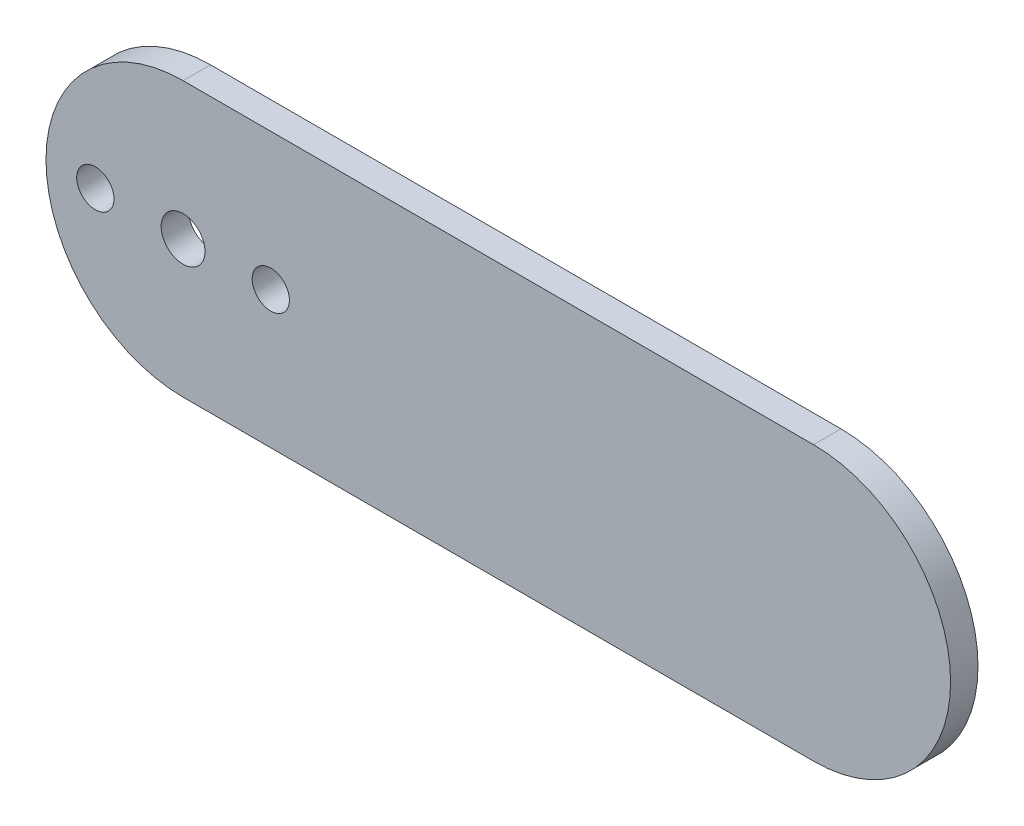
ISO-10303-21;
HEADER;
FILE_DESCRIPTION(('STEP AP214'),'2;1');
FILE_NAME('part.step','',(''),(''),'','','');
FILE_SCHEMA(('AUTOMOTIVE_DESIGN { 1 0 10303 214 1 1 1 1 }'));
ENDSEC;
DATA;
#1=APPLICATION_CONTEXT('core data for automotive mechanical design processes');
#2=APPLICATION_PROTOCOL_DEFINITION('international standard','automotive_design',2000,#1);
#3=PRODUCT_CONTEXT('',#1,'mechanical');
#4=PRODUCT('Part','Part','',(#3));
#5=PRODUCT_RELATED_PRODUCT_CATEGORY('part','',(#4));
#6=PRODUCT_DEFINITION_FORMATION('','',#4);
#7=PRODUCT_DEFINITION_CONTEXT('part definition',#1,'design');
#8=PRODUCT_DEFINITION('design','',#6,#7);
#9=PRODUCT_DEFINITION_SHAPE('','',#8);
#10=(LENGTH_UNIT() NAMED_UNIT(*) SI_UNIT(.MILLI.,.METRE.));
#11=(NAMED_UNIT(*) PLANE_ANGLE_UNIT() SI_UNIT($,.RADIAN.));
#12=(NAMED_UNIT(*) SI_UNIT($,.STERADIAN.) SOLID_ANGLE_UNIT());
#13=UNCERTAINTY_MEASURE_WITH_UNIT(LENGTH_MEASURE(1.E-05),#10,'distance_accuracy_value','');
#14=(GEOMETRIC_REPRESENTATION_CONTEXT(3) GLOBAL_UNCERTAINTY_ASSIGNED_CONTEXT((#13)) GLOBAL_UNIT_ASSIGNED_CONTEXT((#10,
#11,#12)) REPRESENTATION_CONTEXT('',''));
#15=CARTESIAN_POINT('',(0.,0.,0.));
#16=DIRECTION('',(0.,0.,1.));
#17=DIRECTION('',(1.,0.,0.));
#18=AXIS2_PLACEMENT_3D('',#15,#16,#17);
#19=CARTESIAN_POINT('',(0.,0.,2.5));
#20=DIRECTION('',(0.,0.,1.));
#21=DIRECTION('',(1.,0.,0.));
#22=AXIS2_PLACEMENT_3D('',#19,#20,#21);
#23=PLANE('',#22);
#24=CARTESIAN_POINT('',(16.,0.,2.5));
#25=DIRECTION('',(0.,0.,1.));
#26=DIRECTION('',(1.,0.,0.));
#27=AXIS2_PLACEMENT_3D('',#24,#25,#26);
#28=CIRCLE('',#27,3.4);
#29=CARTESIAN_POINT('',(19.4,0.,2.5));
#30=VERTEX_POINT('',#29);
#31=EDGE_CURVE('E114',#30,#30,#28,.T.);
#32=ORIENTED_EDGE('',*,*,#31,.F.);
#33=EDGE_LOOP('',(#32));
#34=FACE_BOUND('',#33,.T.);
#35=CARTESIAN_POINT('',(0.,0.,2.5));
#36=DIRECTION('',(0.,0.,1.));
#37=DIRECTION('',(1.,0.,0.));
#38=AXIS2_PLACEMENT_3D('',#35,#36,#37);
#39=CIRCLE('',#38,25.);
#40=CARTESIAN_POINT('',(0.,25.,2.5));
#41=VERTEX_POINT('',#40);
#42=CARTESIAN_POINT('',(0.,-25.,2.5));
#43=VERTEX_POINT('',#42);
#44=EDGE_CURVE('E84',#41,#43,#39,.T.);
#45=ORIENTED_EDGE('',*,*,#44,.T.);
#46=DIRECTION('',(1.,0.,0.));
#47=VECTOR('',#46,1.);
#48=CARTESIAN_POINT('',(0.,-25.,2.5));
#49=LINE('',#48,#47);
#50=CARTESIAN_POINT('',(115.,-25.,2.5));
#51=VERTEX_POINT('',#50);
#52=EDGE_CURVE('E79',#43,#51,#49,.T.);
#53=ORIENTED_EDGE('',*,*,#52,.T.);
#54=CARTESIAN_POINT('',(115.,0.,2.5));
#55=DIRECTION('',(0.,0.,1.));
#56=DIRECTION('',(1.,0.,0.));
#57=AXIS2_PLACEMENT_3D('',#54,#55,#56);
#58=CIRCLE('',#57,25.);
#59=CARTESIAN_POINT('',(115.,25.,2.5));
#60=VERTEX_POINT('',#59);
#61=EDGE_CURVE('E82',#51,#60,#58,.T.);
#62=ORIENTED_EDGE('',*,*,#61,.T.);
#63=DIRECTION('',(-1.,0.,0.));
#64=VECTOR('',#63,1.);
#65=CARTESIAN_POINT('',(0.,25.,2.5));
#66=LINE('',#65,#64);
#67=EDGE_CURVE('E49',#60,#41,#66,.T.);
#68=ORIENTED_EDGE('',*,*,#67,.T.);
#69=EDGE_LOOP('',(#45,#53,#62,#68));
#70=FACE_BOUND('',#69,.T.);
#71=CARTESIAN_POINT('',(0.,0.,2.5));
#72=DIRECTION('',(0.,0.,1.));
#73=DIRECTION('',(1.,0.,0.));
#74=AXIS2_PLACEMENT_3D('',#71,#72,#73);
#75=CIRCLE('',#74,4.);
#76=CARTESIAN_POINT('',(4.,0.,2.5));
#77=VERTEX_POINT('',#76);
#78=EDGE_CURVE('E99',#77,#77,#75,.T.);
#79=ORIENTED_EDGE('',*,*,#78,.F.);
#80=EDGE_LOOP('',(#79));
#81=FACE_BOUND('',#80,.T.);
#82=CARTESIAN_POINT('',(-16.,0.,2.5));
#83=DIRECTION('',(0.,0.,1.));
#84=DIRECTION('',(1.,0.,0.));
#85=AXIS2_PLACEMENT_3D('',#82,#83,#84);
#86=CIRCLE('',#85,3.4);
#87=CARTESIAN_POINT('',(-12.6,0.,2.5));
#88=VERTEX_POINT('',#87);
#89=EDGE_CURVE('E120',#88,#88,#86,.T.);
#90=ORIENTED_EDGE('',*,*,#89,.F.);
#91=EDGE_LOOP('',(#90));
#92=FACE_BOUND('',#91,.T.);
#93=ADVANCED_FACE('F32',(#34,#70,#81,#92),#23,.T.);
#94=CARTESIAN_POINT('',(0.,0.,-2.5));
#95=DIRECTION('',(0.,0.,1.));
#96=DIRECTION('',(1.,0.,0.));
#97=AXIS2_PLACEMENT_3D('',#94,#95,#96);
#98=PLANE('',#97);
#99=CARTESIAN_POINT('',(0.,0.,-2.5));
#100=DIRECTION('',(0.,0.,1.));
#101=DIRECTION('',(1.,0.,0.));
#102=AXIS2_PLACEMENT_3D('',#99,#100,#101);
#103=CIRCLE('',#102,25.);
#104=CARTESIAN_POINT('',(0.,25.,-2.5));
#105=VERTEX_POINT('',#104);
#106=CARTESIAN_POINT('',(0.,-25.,-2.5));
#107=VERTEX_POINT('',#106);
#108=EDGE_CURVE('E96',#105,#107,#103,.T.);
#109=ORIENTED_EDGE('',*,*,#108,.F.);
#110=DIRECTION('',(-1.,0.,0.));
#111=VECTOR('',#110,1.);
#112=CARTESIAN_POINT('',(0.,25.,-2.5));
#113=LINE('',#112,#111);
#114=CARTESIAN_POINT('',(115.,25.,-2.5));
#115=VERTEX_POINT('',#114);
#116=EDGE_CURVE('E72',#115,#105,#113,.T.);
#117=ORIENTED_EDGE('',*,*,#116,.F.);
#118=CARTESIAN_POINT('',(115.,0.,-2.5));
#119=DIRECTION('',(0.,0.,1.));
#120=DIRECTION('',(1.,0.,0.));
#121=AXIS2_PLACEMENT_3D('',#118,#119,#120);
#122=CIRCLE('',#121,25.);
#123=CARTESIAN_POINT('',(115.,-25.,-2.5));
#124=VERTEX_POINT('',#123);
#125=EDGE_CURVE('E66',#124,#115,#122,.T.);
#126=ORIENTED_EDGE('',*,*,#125,.F.);
#127=DIRECTION('',(1.,0.,0.));
#128=VECTOR('',#127,1.);
#129=CARTESIAN_POINT('',(0.,-25.,-2.5));
#130=LINE('',#129,#128);
#131=EDGE_CURVE('E88',#107,#124,#130,.T.);
#132=ORIENTED_EDGE('',*,*,#131,.F.);
#133=EDGE_LOOP('',(#109,#117,#126,#132));
#134=FACE_BOUND('',#133,.T.);
#135=CARTESIAN_POINT('',(0.,0.,-2.5));
#136=DIRECTION('',(0.,0.,1.));
#137=DIRECTION('',(1.,0.,0.));
#138=AXIS2_PLACEMENT_3D('',#135,#136,#137);
#139=CIRCLE('',#138,4.);
#140=CARTESIAN_POINT('',(4.,0.,-2.5));
#141=VERTEX_POINT('',#140);
#142=EDGE_CURVE('E111',#141,#141,#139,.T.);
#143=ORIENTED_EDGE('',*,*,#142,.T.);
#144=EDGE_LOOP('',(#143));
#145=FACE_BOUND('',#144,.T.);
#146=CARTESIAN_POINT('',(16.,0.,-2.5));
#147=DIRECTION('',(0.,0.,1.));
#148=DIRECTION('',(1.,0.,0.));
#149=AXIS2_PLACEMENT_3D('',#146,#147,#148);
#150=CIRCLE('',#149,3.4);
#151=CARTESIAN_POINT('',(19.4,0.,-2.5));
#152=VERTEX_POINT('',#151);
#153=EDGE_CURVE('E117',#152,#152,#150,.T.);
#154=ORIENTED_EDGE('',*,*,#153,.T.);
#155=EDGE_LOOP('',(#154));
#156=FACE_BOUND('',#155,.T.);
#157=CARTESIAN_POINT('',(-16.,0.,-2.5));
#158=DIRECTION('',(0.,0.,1.));
#159=DIRECTION('',(1.,0.,0.));
#160=AXIS2_PLACEMENT_3D('',#157,#158,#159);
#161=CIRCLE('',#160,3.4);
#162=CARTESIAN_POINT('',(-12.6,0.,-2.5));
#163=VERTEX_POINT('',#162);
#164=EDGE_CURVE('E123',#163,#163,#161,.T.);
#165=ORIENTED_EDGE('',*,*,#164,.T.);
#166=EDGE_LOOP('',(#165));
#167=FACE_BOUND('',#166,.T.);
#168=ADVANCED_FACE('F107',(#134,#145,#156,#167),#98,.F.);
#169=CARTESIAN_POINT('',(0.,0.,2.5));
#170=DIRECTION('',(0.,0.,-1.));
#171=DIRECTION('',(-1.,0.,0.));
#172=AXIS2_PLACEMENT_3D('',#169,#170,#171);
#173=CYLINDRICAL_SURFACE('',#172,25.);
#174=ORIENTED_EDGE('',*,*,#108,.T.);
#175=DIRECTION('',(0.,0.,-1.));
#176=VECTOR('',#175,1.);
#177=CARTESIAN_POINT('',(0.,-25.,2.5));
#178=LINE('',#177,#176);
#179=EDGE_CURVE('E11',#43,#107,#178,.T.);
#180=ORIENTED_EDGE('',*,*,#179,.F.);
#181=ORIENTED_EDGE('',*,*,#44,.F.);
#182=DIRECTION('',(0.,0.,-1.));
#183=VECTOR('',#182,1.);
#184=CARTESIAN_POINT('',(0.,25.,2.5));
#185=LINE('',#184,#183);
#186=EDGE_CURVE('E92',#41,#105,#185,.T.);
#187=ORIENTED_EDGE('',*,*,#186,.T.);
#188=EDGE_LOOP('',(#174,#180,#181,#187));
#189=FACE_BOUND('',#188,.T.);
#190=ADVANCED_FACE('F34',(#189),#173,.T.);
#191=CARTESIAN_POINT('',(0.,-25.,2.5));
#192=DIRECTION('',(0.,1.,0.));
#193=DIRECTION('',(0.,0.,1.));
#194=AXIS2_PLACEMENT_3D('',#191,#192,#193);
#195=PLANE('',#194);
#196=ORIENTED_EDGE('',*,*,#131,.T.);
#197=DIRECTION('',(0.,0.,-1.));
#198=VECTOR('',#197,1.);
#199=CARTESIAN_POINT('',(115.,-25.,2.5));
#200=LINE('',#199,#198);
#201=EDGE_CURVE('E41',#51,#124,#200,.T.);
#202=ORIENTED_EDGE('',*,*,#201,.F.);
#203=ORIENTED_EDGE('',*,*,#52,.F.);
#204=ORIENTED_EDGE('',*,*,#179,.T.);
#205=EDGE_LOOP('',(#196,#202,#203,#204));
#206=FACE_BOUND('',#205,.T.);
#207=ADVANCED_FACE('F87',(#206),#195,.F.);
#208=CARTESIAN_POINT('',(115.,0.,2.5));
#209=DIRECTION('',(0.,0.,-1.));
#210=DIRECTION('',(-1.,0.,0.));
#211=AXIS2_PLACEMENT_3D('',#208,#209,#210);
#212=CYLINDRICAL_SURFACE('',#211,25.);
#213=ORIENTED_EDGE('',*,*,#125,.T.);
#214=DIRECTION('',(0.,0.,-1.));
#215=VECTOR('',#214,1.);
#216=CARTESIAN_POINT('',(115.,25.,2.5));
#217=LINE('',#216,#215);
#218=EDGE_CURVE('E89',#60,#115,#217,.T.);
#219=ORIENTED_EDGE('',*,*,#218,.F.);
#220=ORIENTED_EDGE('',*,*,#61,.F.);
#221=ORIENTED_EDGE('',*,*,#201,.T.);
#222=EDGE_LOOP('',(#213,#219,#220,#221));
#223=FACE_BOUND('',#222,.T.);
#224=ADVANCED_FACE('F90',(#223),#212,.T.);
#225=CARTESIAN_POINT('',(0.,25.,2.5));
#226=DIRECTION('',(0.,-1.,0.));
#227=DIRECTION('',(0.,0.,-1.));
#228=AXIS2_PLACEMENT_3D('',#225,#226,#227);
#229=PLANE('',#228);
#230=ORIENTED_EDGE('',*,*,#116,.T.);
#231=ORIENTED_EDGE('',*,*,#186,.F.);
#232=ORIENTED_EDGE('',*,*,#67,.F.);
#233=ORIENTED_EDGE('',*,*,#218,.T.);
#234=EDGE_LOOP('',(#230,#231,#232,#233));
#235=FACE_BOUND('',#234,.T.);
#236=ADVANCED_FACE('F104',(#235),#229,.F.);
#237=CARTESIAN_POINT('',(0.,0.,2.5));
#238=DIRECTION('',(0.,0.,-1.));
#239=DIRECTION('',(-1.,0.,0.));
#240=AXIS2_PLACEMENT_3D('',#237,#238,#239);
#241=CYLINDRICAL_SURFACE('',#240,4.);
#242=ORIENTED_EDGE('',*,*,#78,.T.);
#243=EDGE_LOOP('',(#242));
#244=FACE_BOUND('',#243,.T.);
#245=ORIENTED_EDGE('',*,*,#142,.F.);
#246=EDGE_LOOP('',(#245));
#247=FACE_BOUND('',#246,.T.);
#248=ADVANCED_FACE('F141',(#244,#247),#241,.F.);
#249=CARTESIAN_POINT('',(16.,0.,2.5));
#250=DIRECTION('',(0.,0.,-1.));
#251=DIRECTION('',(-1.,0.,0.));
#252=AXIS2_PLACEMENT_3D('',#249,#250,#251);
#253=CYLINDRICAL_SURFACE('',#252,3.4);
#254=ORIENTED_EDGE('',*,*,#31,.T.);
#255=EDGE_LOOP('',(#254));
#256=FACE_BOUND('',#255,.T.);
#257=ORIENTED_EDGE('',*,*,#153,.F.);
#258=EDGE_LOOP('',(#257));
#259=FACE_BOUND('',#258,.T.);
#260=ADVANCED_FACE('F187',(#256,#259),#253,.F.);
#261=CARTESIAN_POINT('',(-16.,0.,2.5));
#262=DIRECTION('',(0.,0.,-1.));
#263=DIRECTION('',(-1.,0.,0.));
#264=AXIS2_PLACEMENT_3D('',#261,#262,#263);
#265=CYLINDRICAL_SURFACE('',#264,3.4);
#266=ORIENTED_EDGE('',*,*,#89,.T.);
#267=EDGE_LOOP('',(#266));
#268=FACE_BOUND('',#267,.T.);
#269=ORIENTED_EDGE('',*,*,#164,.F.);
#270=EDGE_LOOP('',(#269));
#271=FACE_BOUND('',#270,.T.);
#272=ADVANCED_FACE('F129',(#268,#271),#265,.F.);
#273=CLOSED_SHELL('',(#93,#168,#190,#207,#224,#236,#248,#260,#272));
#274=MANIFOLD_SOLID_BREP('B2',#273);
#275=ADVANCED_BREP_SHAPE_REPRESENTATION('',(#18,#274),#14);
#276=SHAPE_DEFINITION_REPRESENTATION(#9,#275);
ENDSEC;
END-ISO-10303-21;
